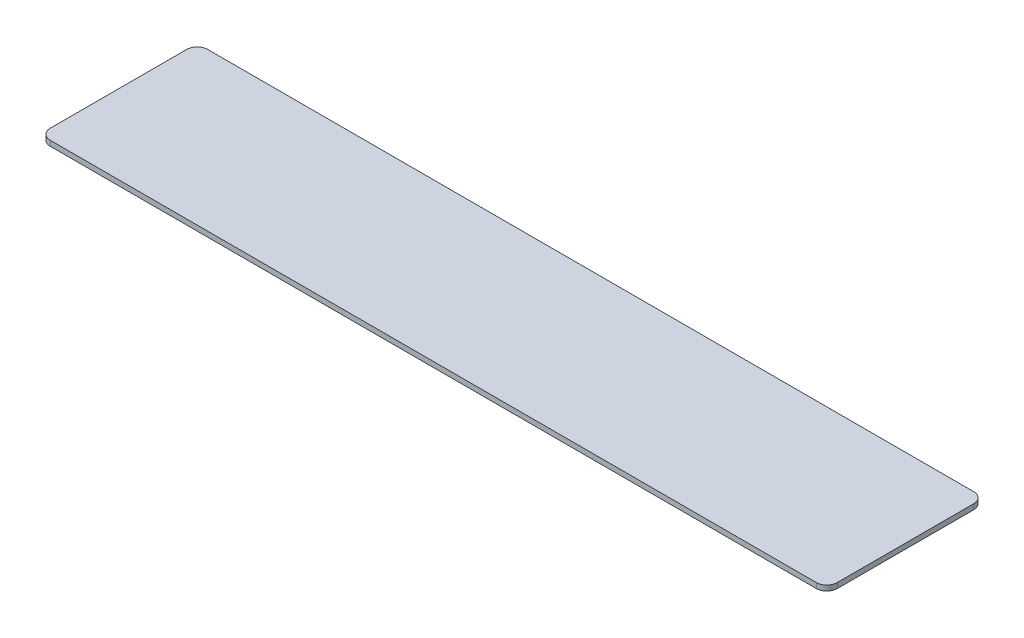
ISO-10303-21;
HEADER;
FILE_DESCRIPTION(('STEP AP214'),'2;1');
FILE_NAME('part.step','',(''),(''),'','','');
FILE_SCHEMA(('AUTOMOTIVE_DESIGN { 1 0 10303 214 1 1 1 1 }'));
ENDSEC;
DATA;
#1=APPLICATION_CONTEXT('core data for automotive mechanical design processes');
#2=APPLICATION_PROTOCOL_DEFINITION('international standard','automotive_design',2000,#1);
#3=PRODUCT_CONTEXT('',#1,'mechanical');
#4=PRODUCT('Part','Part','',(#3));
#5=PRODUCT_RELATED_PRODUCT_CATEGORY('part','',(#4));
#6=PRODUCT_DEFINITION_FORMATION('','',#4);
#7=PRODUCT_DEFINITION_CONTEXT('part definition',#1,'design');
#8=PRODUCT_DEFINITION('design','',#6,#7);
#9=PRODUCT_DEFINITION_SHAPE('','',#8);
#10=(LENGTH_UNIT() NAMED_UNIT(*) SI_UNIT(.MILLI.,.METRE.));
#11=(NAMED_UNIT(*) PLANE_ANGLE_UNIT() SI_UNIT($,.RADIAN.));
#12=(NAMED_UNIT(*) SI_UNIT($,.STERADIAN.) SOLID_ANGLE_UNIT());
#13=UNCERTAINTY_MEASURE_WITH_UNIT(LENGTH_MEASURE(1.E-05),#10,'distance_accuracy_value','');
#14=(GEOMETRIC_REPRESENTATION_CONTEXT(3) GLOBAL_UNCERTAINTY_ASSIGNED_CONTEXT((#13)) GLOBAL_UNIT_ASSIGNED_CONTEXT((#10,
#11,#12)) REPRESENTATION_CONTEXT('',''));
#15=CARTESIAN_POINT('',(0.,0.,0.));
#16=DIRECTION('',(0.,0.,1.));
#17=DIRECTION('',(1.,0.,0.));
#18=AXIS2_PLACEMENT_3D('',#15,#16,#17);
#19=CARTESIAN_POINT('',(0.,1.27,0.));
#20=DIRECTION('',(1.,0.,0.));
#21=DIRECTION('',(0.,0.,-1.));
#22=AXIS2_PLACEMENT_3D('',#19,#20,#21);
#23=PLANE('',#22);
#24=DIRECTION('',(0.,0.,1.));
#25=VECTOR('',#24,1.);
#26=CARTESIAN_POINT('',(0.,1.27,0.));
#27=LINE('',#26,#25);
#28=CARTESIAN_POINT('',(0.,1.27,-35.56));
#29=VERTEX_POINT('',#28);
#30=CARTESIAN_POINT('',(0.,1.27,-2.54));
#31=VERTEX_POINT('',#30);
#32=EDGE_CURVE('E128',#29,#31,#27,.T.);
#33=ORIENTED_EDGE('',*,*,#32,.F.);
#34=DIRECTION('',(0.,-1.,0.));
#35=VECTOR('',#34,1.);
#36=CARTESIAN_POINT('',(0.,1.27,-35.56));
#37=LINE('',#36,#35);
#38=CARTESIAN_POINT('',(0.,0.,-35.56));
#39=VERTEX_POINT('',#38);
#40=EDGE_CURVE('E11',#29,#39,#37,.T.);
#41=ORIENTED_EDGE('',*,*,#40,.T.);
#42=DIRECTION('',(0.,0.,1.));
#43=VECTOR('',#42,1.);
#44=CARTESIAN_POINT('',(0.,0.,0.));
#45=LINE('',#44,#43);
#46=CARTESIAN_POINT('',(0.,0.,-2.54));
#47=VERTEX_POINT('',#46);
#48=EDGE_CURVE('E130',#39,#47,#45,.T.);
#49=ORIENTED_EDGE('',*,*,#48,.T.);
#50=DIRECTION('',(0.,-1.,0.));
#51=VECTOR('',#50,1.);
#52=CARTESIAN_POINT('',(0.,1.27,-2.54));
#53=LINE('',#52,#51);
#54=EDGE_CURVE('E41',#47,#31,#53,.F.);
#55=ORIENTED_EDGE('',*,*,#54,.T.);
#56=EDGE_LOOP('',(#33,#41,#49,#55));
#57=FACE_BOUND('',#56,.T.);
#58=ADVANCED_FACE('F33',(#57),#23,.F.);
#59=CARTESIAN_POINT('',(0.,1.27,0.));
#60=DIRECTION('',(0.,0.,-1.));
#61=DIRECTION('',(-1.,0.,0.));
#62=AXIS2_PLACEMENT_3D('',#59,#60,#61);
#63=PLANE('',#62);
#64=DIRECTION('',(1.,0.,0.));
#65=VECTOR('',#64,1.);
#66=CARTESIAN_POINT('',(0.,0.,0.));
#67=LINE('',#66,#65);
#68=CARTESIAN_POINT('',(2.54,0.,0.));
#69=VERTEX_POINT('',#68);
#70=CARTESIAN_POINT('',(187.96,0.,0.));
#71=VERTEX_POINT('',#70);
#72=EDGE_CURVE('E126',#69,#71,#67,.T.);
#73=ORIENTED_EDGE('',*,*,#72,.T.);
#74=DIRECTION('',(0.,-1.,0.));
#75=VECTOR('',#74,1.);
#76=CARTESIAN_POINT('',(187.96,1.27,0.));
#77=LINE('',#76,#75);
#78=CARTESIAN_POINT('',(187.96,1.27,0.));
#79=VERTEX_POINT('',#78);
#80=EDGE_CURVE('E105',#71,#79,#77,.F.);
#81=ORIENTED_EDGE('',*,*,#80,.T.);
#82=DIRECTION('',(1.,0.,0.));
#83=VECTOR('',#82,1.);
#84=CARTESIAN_POINT('',(0.,1.27,0.));
#85=LINE('',#84,#83);
#86=CARTESIAN_POINT('',(2.54,1.27,0.));
#87=VERTEX_POINT('',#86);
#88=EDGE_CURVE('E166',#87,#79,#85,.T.);
#89=ORIENTED_EDGE('',*,*,#88,.F.);
#90=DIRECTION('',(0.,-1.,0.));
#91=VECTOR('',#90,1.);
#92=CARTESIAN_POINT('',(2.54,1.27,0.));
#93=LINE('',#92,#91);
#94=EDGE_CURVE('E110',#87,#69,#93,.T.);
#95=ORIENTED_EDGE('',*,*,#94,.T.);
#96=EDGE_LOOP('',(#73,#81,#89,#95));
#97=FACE_BOUND('',#96,.T.);
#98=ADVANCED_FACE('F170',(#97),#63,.F.);
#99=CARTESIAN_POINT('',(190.5,1.27,0.));
#100=DIRECTION('',(-1.,0.,0.));
#101=DIRECTION('',(0.,0.,1.));
#102=AXIS2_PLACEMENT_3D('',#99,#100,#101);
#103=PLANE('',#102);
#104=DIRECTION('',(0.,0.,-1.));
#105=VECTOR('',#104,1.);
#106=CARTESIAN_POINT('',(190.5,1.27,0.));
#107=LINE('',#106,#105);
#108=CARTESIAN_POINT('',(190.5,1.27,-2.54));
#109=VERTEX_POINT('',#108);
#110=CARTESIAN_POINT('',(190.5,1.27,-35.56));
#111=VERTEX_POINT('',#110);
#112=EDGE_CURVE('E119',#109,#111,#107,.T.);
#113=ORIENTED_EDGE('',*,*,#112,.F.);
#114=DIRECTION('',(0.,-1.,0.));
#115=VECTOR('',#114,1.);
#116=CARTESIAN_POINT('',(190.5,1.27,-2.54));
#117=LINE('',#116,#115);
#118=CARTESIAN_POINT('',(190.5,0.,-2.54));
#119=VERTEX_POINT('',#118);
#120=EDGE_CURVE('E104',#109,#119,#117,.T.);
#121=ORIENTED_EDGE('',*,*,#120,.T.);
#122=DIRECTION('',(0.,0.,-1.));
#123=VECTOR('',#122,1.);
#124=CARTESIAN_POINT('',(190.5,0.,0.));
#125=LINE('',#124,#123);
#126=CARTESIAN_POINT('',(190.5,0.,-35.56));
#127=VERTEX_POINT('',#126);
#128=EDGE_CURVE('E117',#119,#127,#125,.T.);
#129=ORIENTED_EDGE('',*,*,#128,.T.);
#130=DIRECTION('',(0.,-1.,0.));
#131=VECTOR('',#130,1.);
#132=CARTESIAN_POINT('',(190.5,1.27,-35.56));
#133=LINE('',#132,#131);
#134=EDGE_CURVE('E121',#127,#111,#133,.F.);
#135=ORIENTED_EDGE('',*,*,#134,.T.);
#136=EDGE_LOOP('',(#113,#121,#129,#135));
#137=FACE_BOUND('',#136,.T.);
#138=ADVANCED_FACE('F116',(#137),#103,.F.);
#139=CARTESIAN_POINT('',(0.,1.27,-38.1));
#140=DIRECTION('',(0.,0.,1.));
#141=DIRECTION('',(1.,0.,0.));
#142=AXIS2_PLACEMENT_3D('',#139,#140,#141);
#143=PLANE('',#142);
#144=DIRECTION('',(-1.,0.,0.));
#145=VECTOR('',#144,1.);
#146=CARTESIAN_POINT('',(0.,1.27,-38.1));
#147=LINE('',#146,#145);
#148=CARTESIAN_POINT('',(187.96,1.27,-38.1));
#149=VERTEX_POINT('',#148);
#150=CARTESIAN_POINT('',(2.54,1.27,-38.1));
#151=VERTEX_POINT('',#150);
#152=EDGE_CURVE('E134',#149,#151,#147,.T.);
#153=ORIENTED_EDGE('',*,*,#152,.F.);
#154=DIRECTION('',(0.,-1.,0.));
#155=VECTOR('',#154,1.);
#156=CARTESIAN_POINT('',(187.96,1.27,-38.1));
#157=LINE('',#156,#155);
#158=CARTESIAN_POINT('',(187.96,0.,-38.1));
#159=VERTEX_POINT('',#158);
#160=EDGE_CURVE('E151',#149,#159,#157,.T.);
#161=ORIENTED_EDGE('',*,*,#160,.T.);
#162=DIRECTION('',(-1.,0.,0.));
#163=VECTOR('',#162,1.);
#164=CARTESIAN_POINT('',(0.,0.,-38.1));
#165=LINE('',#164,#163);
#166=CARTESIAN_POINT('',(2.54,0.,-38.1));
#167=VERTEX_POINT('',#166);
#168=EDGE_CURVE('E125',#159,#167,#165,.T.);
#169=ORIENTED_EDGE('',*,*,#168,.T.);
#170=DIRECTION('',(0.,-1.,0.));
#171=VECTOR('',#170,1.);
#172=CARTESIAN_POINT('',(2.54,1.27,-38.1));
#173=LINE('',#172,#171);
#174=EDGE_CURVE('E48',#167,#151,#173,.F.);
#175=ORIENTED_EDGE('',*,*,#174,.T.);
#176=EDGE_LOOP('',(#153,#161,#169,#175));
#177=FACE_BOUND('',#176,.T.);
#178=ADVANCED_FACE('F177',(#177),#143,.F.);
#179=CARTESIAN_POINT('',(0.,1.27,0.));
#180=DIRECTION('',(0.,-1.,0.));
#181=DIRECTION('',(0.,0.,-1.));
#182=AXIS2_PLACEMENT_3D('',#179,#180,#181);
#183=PLANE('',#182);
#184=ORIENTED_EDGE('',*,*,#88,.T.);
#185=CARTESIAN_POINT('',(187.96,1.27,-2.54));
#186=DIRECTION('',(0.,-1.,0.));
#187=DIRECTION('',(0.,0.,-1.));
#188=AXIS2_PLACEMENT_3D('',#185,#186,#187);
#189=CIRCLE('',#188,2.54);
#190=EDGE_CURVE('E148',#79,#109,#189,.F.);
#191=ORIENTED_EDGE('',*,*,#190,.T.);
#192=ORIENTED_EDGE('',*,*,#112,.T.);
#193=CARTESIAN_POINT('',(187.96,1.27,-35.56));
#194=DIRECTION('',(0.,-1.,0.));
#195=DIRECTION('',(0.,0.,-1.));
#196=AXIS2_PLACEMENT_3D('',#193,#194,#195);
#197=CIRCLE('',#196,2.54);
#198=EDGE_CURVE('E55',#111,#149,#197,.F.);
#199=ORIENTED_EDGE('',*,*,#198,.T.);
#200=ORIENTED_EDGE('',*,*,#152,.T.);
#201=CARTESIAN_POINT('',(2.54,1.27,-35.56));
#202=DIRECTION('',(0.,-1.,0.));
#203=DIRECTION('',(0.,0.,-1.));
#204=AXIS2_PLACEMENT_3D('',#201,#202,#203);
#205=CIRCLE('',#204,2.54);
#206=EDGE_CURVE('E145',#151,#29,#205,.F.);
#207=ORIENTED_EDGE('',*,*,#206,.T.);
#208=ORIENTED_EDGE('',*,*,#32,.T.);
#209=CARTESIAN_POINT('',(2.54,1.27,-2.54));
#210=DIRECTION('',(0.,-1.,0.));
#211=DIRECTION('',(0.,0.,-1.));
#212=AXIS2_PLACEMENT_3D('',#209,#210,#211);
#213=CIRCLE('',#212,2.54);
#214=EDGE_CURVE('E143',#31,#87,#213,.F.);
#215=ORIENTED_EDGE('',*,*,#214,.T.);
#216=EDGE_LOOP('',(#184,#191,#192,#199,#200,#207,#208,#215));
#217=FACE_BOUND('',#216,.T.);
#218=ADVANCED_FACE('F163',(#217),#183,.F.);
#219=CARTESIAN_POINT('',(0.,0.,0.));
#220=DIRECTION('',(0.,-1.,0.));
#221=DIRECTION('',(0.,0.,-1.));
#222=AXIS2_PLACEMENT_3D('',#219,#220,#221);
#223=PLANE('',#222);
#224=ORIENTED_EDGE('',*,*,#128,.F.);
#225=CARTESIAN_POINT('',(187.96,0.,-2.54));
#226=DIRECTION('',(0.,-1.,0.));
#227=DIRECTION('',(0.,0.,-1.));
#228=AXIS2_PLACEMENT_3D('',#225,#226,#227);
#229=CIRCLE('',#228,2.54);
#230=EDGE_CURVE('E100',#119,#71,#229,.T.);
#231=ORIENTED_EDGE('',*,*,#230,.T.);
#232=ORIENTED_EDGE('',*,*,#72,.F.);
#233=CARTESIAN_POINT('',(2.54,0.,-2.54));
#234=DIRECTION('',(0.,-1.,0.));
#235=DIRECTION('',(0.,0.,-1.));
#236=AXIS2_PLACEMENT_3D('',#233,#234,#235);
#237=CIRCLE('',#236,2.54);
#238=EDGE_CURVE('E120',#69,#47,#237,.T.);
#239=ORIENTED_EDGE('',*,*,#238,.T.);
#240=ORIENTED_EDGE('',*,*,#48,.F.);
#241=CARTESIAN_POINT('',(2.54,0.,-35.56));
#242=DIRECTION('',(0.,-1.,0.));
#243=DIRECTION('',(0.,0.,-1.));
#244=AXIS2_PLACEMENT_3D('',#241,#242,#243);
#245=CIRCLE('',#244,2.54);
#246=EDGE_CURVE('E137',#39,#167,#245,.T.);
#247=ORIENTED_EDGE('',*,*,#246,.T.);
#248=ORIENTED_EDGE('',*,*,#168,.F.);
#249=CARTESIAN_POINT('',(187.96,0.,-35.56));
#250=DIRECTION('',(0.,-1.,0.));
#251=DIRECTION('',(0.,0.,-1.));
#252=AXIS2_PLACEMENT_3D('',#249,#250,#251);
#253=CIRCLE('',#252,2.54);
#254=EDGE_CURVE('E111',#159,#127,#253,.T.);
#255=ORIENTED_EDGE('',*,*,#254,.T.);
#256=EDGE_LOOP('',(#224,#231,#232,#239,#240,#247,#248,#255));
#257=FACE_BOUND('',#256,.T.);
#258=ADVANCED_FACE('F123',(#257),#223,.T.);
#259=CARTESIAN_POINT('',(187.96,1.27,-2.54));
#260=DIRECTION('',(0.,-1.,0.));
#261=DIRECTION('',(0.,0.,-1.));
#262=AXIS2_PLACEMENT_3D('',#259,#260,#261);
#263=CYLINDRICAL_SURFACE('',#262,2.54);
#264=ORIENTED_EDGE('',*,*,#190,.F.);
#265=ORIENTED_EDGE('',*,*,#80,.F.);
#266=ORIENTED_EDGE('',*,*,#230,.F.);
#267=ORIENTED_EDGE('',*,*,#120,.F.);
#268=EDGE_LOOP('',(#264,#265,#266,#267));
#269=FACE_BOUND('',#268,.T.);
#270=ADVANCED_FACE('F103',(#269),#263,.T.);
#271=CARTESIAN_POINT('',(187.96,1.27,-35.56));
#272=DIRECTION('',(0.,-1.,0.));
#273=DIRECTION('',(0.,0.,-1.));
#274=AXIS2_PLACEMENT_3D('',#271,#272,#273);
#275=CYLINDRICAL_SURFACE('',#274,2.54);
#276=ORIENTED_EDGE('',*,*,#198,.F.);
#277=ORIENTED_EDGE('',*,*,#134,.F.);
#278=ORIENTED_EDGE('',*,*,#254,.F.);
#279=ORIENTED_EDGE('',*,*,#160,.F.);
#280=EDGE_LOOP('',(#276,#277,#278,#279));
#281=FACE_BOUND('',#280,.T.);
#282=ADVANCED_FACE('F176',(#281),#275,.T.);
#283=CARTESIAN_POINT('',(2.54,1.27,-35.56));
#284=DIRECTION('',(0.,-1.,0.));
#285=DIRECTION('',(0.,0.,-1.));
#286=AXIS2_PLACEMENT_3D('',#283,#284,#285);
#287=CYLINDRICAL_SURFACE('',#286,2.54);
#288=ORIENTED_EDGE('',*,*,#206,.F.);
#289=ORIENTED_EDGE('',*,*,#174,.F.);
#290=ORIENTED_EDGE('',*,*,#246,.F.);
#291=ORIENTED_EDGE('',*,*,#40,.F.);
#292=EDGE_LOOP('',(#288,#289,#290,#291));
#293=FACE_BOUND('',#292,.T.);
#294=ADVANCED_FACE('F179',(#293),#287,.T.);
#295=CARTESIAN_POINT('',(2.54,1.27,-2.54));
#296=DIRECTION('',(0.,-1.,0.));
#297=DIRECTION('',(0.,0.,-1.));
#298=AXIS2_PLACEMENT_3D('',#295,#296,#297);
#299=CYLINDRICAL_SURFACE('',#298,2.54);
#300=ORIENTED_EDGE('',*,*,#214,.F.);
#301=ORIENTED_EDGE('',*,*,#54,.F.);
#302=ORIENTED_EDGE('',*,*,#238,.F.);
#303=ORIENTED_EDGE('',*,*,#94,.F.);
#304=EDGE_LOOP('',(#300,#301,#302,#303));
#305=FACE_BOUND('',#304,.T.);
#306=ADVANCED_FACE('F35',(#305),#299,.T.);
#307=CLOSED_SHELL('',(#58,#98,#138,#178,#218,#258,#270,#282,#294,#306));
#308=MANIFOLD_SOLID_BREP('B2',#307);
#309=ADVANCED_BREP_SHAPE_REPRESENTATION('',(#18,#308),#14);
#310=SHAPE_DEFINITION_REPRESENTATION(#9,#309);
ENDSEC;
END-ISO-10303-21;
